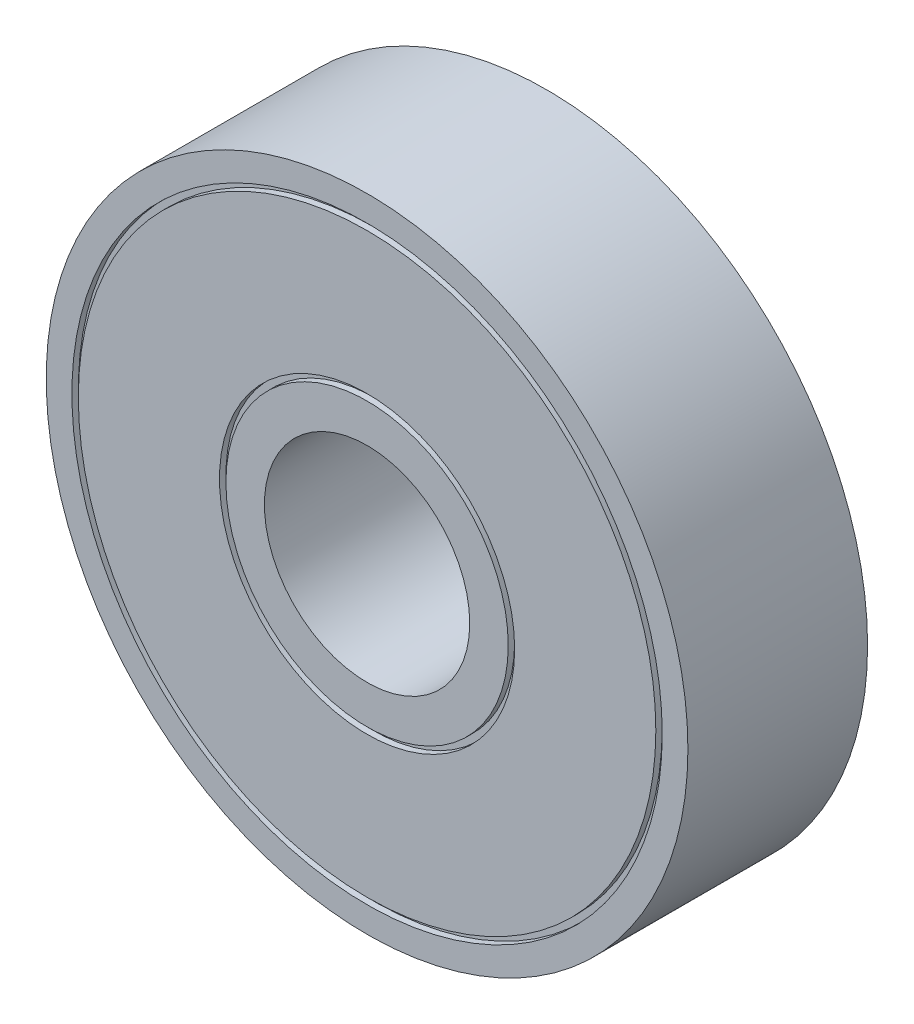
ISO-10303-21;
HEADER;
FILE_DESCRIPTION(('STEP AP214'),'2;1');
FILE_NAME('part.step','',(''),(''),'','','');
FILE_SCHEMA(('AUTOMOTIVE_DESIGN { 1 0 10303 214 1 1 1 1 }'));
ENDSEC;
DATA;
#1=APPLICATION_CONTEXT('core data for automotive mechanical design processes');
#2=APPLICATION_PROTOCOL_DEFINITION('international standard','automotive_design',2000,#1);
#3=PRODUCT_CONTEXT('',#1,'mechanical');
#4=PRODUCT('Part','Part','',(#3));
#5=PRODUCT_RELATED_PRODUCT_CATEGORY('part','',(#4));
#6=PRODUCT_DEFINITION_FORMATION('','',#4);
#7=PRODUCT_DEFINITION_CONTEXT('part definition',#1,'design');
#8=PRODUCT_DEFINITION('design','',#6,#7);
#9=PRODUCT_DEFINITION_SHAPE('','',#8);
#10=(LENGTH_UNIT() NAMED_UNIT(*) SI_UNIT(.MILLI.,.METRE.));
#11=(NAMED_UNIT(*) PLANE_ANGLE_UNIT() SI_UNIT($,.RADIAN.));
#12=(NAMED_UNIT(*) SI_UNIT($,.STERADIAN.) SOLID_ANGLE_UNIT());
#13=UNCERTAINTY_MEASURE_WITH_UNIT(LENGTH_MEASURE(1.E-05),#10,'distance_accuracy_value','');
#14=(GEOMETRIC_REPRESENTATION_CONTEXT(3) GLOBAL_UNCERTAINTY_ASSIGNED_CONTEXT((#13)) GLOBAL_UNIT_ASSIGNED_CONTEXT((#10,
#11,#12)) REPRESENTATION_CONTEXT('',''));
#15=CARTESIAN_POINT('',(0.,0.,0.));
#16=DIRECTION('',(0.,0.,1.));
#17=DIRECTION('',(1.,0.,0.));
#18=AXIS2_PLACEMENT_3D('',#15,#16,#17);
#19=CARTESIAN_POINT('',(0.,0.,-3.5));
#20=DIRECTION('',(0.,0.,1.));
#21=DIRECTION('',(1.,0.,0.));
#22=AXIS2_PLACEMENT_3D('',#19,#20,#21);
#23=PLANE('',#22);
#24=CARTESIAN_POINT('',(0.,0.,-3.5));
#25=DIRECTION('',(0.,0.,1.));
#26=DIRECTION('',(1.,0.,0.));
#27=AXIS2_PLACEMENT_3D('',#24,#25,#26);
#28=CIRCLE('',#27,4.);
#29=CARTESIAN_POINT('',(4.,0.,-3.5));
#30=VERTEX_POINT('',#29);
#31=EDGE_CURVE('E66',#30,#30,#28,.T.);
#32=ORIENTED_EDGE('',*,*,#31,.T.);
#33=EDGE_LOOP('',(#32));
#34=FACE_BOUND('',#33,.T.);
#35=CARTESIAN_POINT('',(0.,0.,-3.5));
#36=DIRECTION('',(0.,0.,1.));
#37=DIRECTION('',(1.,0.,0.));
#38=AXIS2_PLACEMENT_3D('',#35,#36,#37);
#39=CIRCLE('',#38,5.5);
#40=CARTESIAN_POINT('',(5.5,0.,-3.5));
#41=VERTEX_POINT('',#40);
#42=EDGE_CURVE('E111',#41,#41,#39,.T.);
#43=ORIENTED_EDGE('',*,*,#42,.F.);
#44=EDGE_LOOP('',(#43));
#45=FACE_BOUND('',#44,.T.);
#46=ADVANCED_FACE('F51',(#34,#45),#23,.F.);
#47=CARTESIAN_POINT('',(0.,0.,3.5));
#48=DIRECTION('',(0.,0.,1.));
#49=DIRECTION('',(1.,0.,0.));
#50=AXIS2_PLACEMENT_3D('',#47,#48,#49);
#51=PLANE('',#50);
#52=CARTESIAN_POINT('',(0.,0.,3.5));
#53=DIRECTION('',(0.,0.,1.));
#54=DIRECTION('',(1.,0.,0.));
#55=AXIS2_PLACEMENT_3D('',#52,#53,#54);
#56=CIRCLE('',#55,4.);
#57=CARTESIAN_POINT('',(4.,0.,3.5));
#58=VERTEX_POINT('',#57);
#59=EDGE_CURVE('E64',#58,#58,#56,.T.);
#60=ORIENTED_EDGE('',*,*,#59,.F.);
#61=EDGE_LOOP('',(#60));
#62=FACE_BOUND('',#61,.T.);
#63=CARTESIAN_POINT('',(0.,0.,3.5));
#64=DIRECTION('',(0.,0.,1.));
#65=DIRECTION('',(1.,0.,0.));
#66=AXIS2_PLACEMENT_3D('',#63,#64,#65);
#67=CIRCLE('',#66,5.5);
#68=CARTESIAN_POINT('',(5.5,0.,3.5));
#69=VERTEX_POINT('',#68);
#70=EDGE_CURVE('E79',#69,#69,#67,.T.);
#71=ORIENTED_EDGE('',*,*,#70,.T.);
#72=EDGE_LOOP('',(#71));
#73=FACE_BOUND('',#72,.T.);
#74=ADVANCED_FACE('F159',(#62,#73),#51,.T.);
#75=CARTESIAN_POINT('',(0.,0.,3.5));
#76=DIRECTION('',(0.,0.,1.));
#77=DIRECTION('',(1.,0.,0.));
#78=AXIS2_PLACEMENT_3D('',#75,#76,#77);
#79=CIRCLE('',#78,11.5);
#80=CARTESIAN_POINT('',(11.5,0.,3.5));
#81=VERTEX_POINT('',#80);
#82=EDGE_CURVE('E90',#81,#81,#79,.T.);
#83=ORIENTED_EDGE('',*,*,#82,.F.);
#84=EDGE_LOOP('',(#83));
#85=FACE_BOUND('',#84,.T.);
#86=CARTESIAN_POINT('',(0.,0.,3.5));
#87=DIRECTION('',(0.,0.,1.));
#88=DIRECTION('',(1.,0.,0.));
#89=AXIS2_PLACEMENT_3D('',#86,#87,#88);
#90=CIRCLE('',#89,12.5);
#91=CARTESIAN_POINT('',(12.5,0.,3.5));
#92=VERTEX_POINT('',#91);
#93=EDGE_CURVE('E11',#92,#92,#90,.T.);
#94=ORIENTED_EDGE('',*,*,#93,.T.);
#95=EDGE_LOOP('',(#94));
#96=FACE_BOUND('',#95,.T.);
#97=ADVANCED_FACE('F162',(#85,#96),#51,.T.);
#98=CARTESIAN_POINT('',(0.,0.,-3.5));
#99=DIRECTION('',(0.,0.,1.));
#100=DIRECTION('',(1.,0.,0.));
#101=AXIS2_PLACEMENT_3D('',#98,#99,#100);
#102=CIRCLE('',#101,11.5);
#103=CARTESIAN_POINT('',(11.5,0.,-3.5));
#104=VERTEX_POINT('',#103);
#105=EDGE_CURVE('E122',#104,#104,#102,.T.);
#106=ORIENTED_EDGE('',*,*,#105,.T.);
#107=EDGE_LOOP('',(#106));
#108=FACE_BOUND('',#107,.T.);
#109=CARTESIAN_POINT('',(0.,0.,-3.5));
#110=DIRECTION('',(0.,0.,1.));
#111=DIRECTION('',(1.,0.,0.));
#112=AXIS2_PLACEMENT_3D('',#109,#110,#111);
#113=CIRCLE('',#112,12.5);
#114=CARTESIAN_POINT('',(12.5,0.,-3.5));
#115=VERTEX_POINT('',#114);
#116=EDGE_CURVE('E55',#115,#115,#113,.T.);
#117=ORIENTED_EDGE('',*,*,#116,.F.);
#118=EDGE_LOOP('',(#117));
#119=FACE_BOUND('',#118,.T.);
#120=ADVANCED_FACE('F152',(#108,#119),#23,.F.);
#121=CARTESIAN_POINT('',(0.,0.,3.5));
#122=DIRECTION('',(0.,0.,-1.));
#123=DIRECTION('',(-1.,0.,0.));
#124=AXIS2_PLACEMENT_3D('',#121,#122,#123);
#125=CYLINDRICAL_SURFACE('',#124,12.5);
#126=ORIENTED_EDGE('',*,*,#93,.F.);
#127=EDGE_LOOP('',(#126));
#128=FACE_BOUND('',#127,.T.);
#129=ORIENTED_EDGE('',*,*,#116,.T.);
#130=EDGE_LOOP('',(#129));
#131=FACE_BOUND('',#130,.T.);
#132=ADVANCED_FACE('F53',(#128,#131),#125,.T.);
#133=CARTESIAN_POINT('',(0.,0.,3.5));
#134=DIRECTION('',(0.,0.,-1.));
#135=DIRECTION('',(-1.,0.,0.));
#136=AXIS2_PLACEMENT_3D('',#133,#134,#135);
#137=CYLINDRICAL_SURFACE('',#136,4.);
#138=ORIENTED_EDGE('',*,*,#59,.T.);
#139=EDGE_LOOP('',(#138));
#140=FACE_BOUND('',#139,.T.);
#141=ORIENTED_EDGE('',*,*,#31,.F.);
#142=EDGE_LOOP('',(#141));
#143=FACE_BOUND('',#142,.T.);
#144=ADVANCED_FACE('F168',(#140,#143),#137,.F.);
#145=CARTESIAN_POINT('',(0.,0.,3.25));
#146=DIRECTION('',(0.,0.,1.));
#147=DIRECTION('',(1.,0.,0.));
#148=AXIS2_PLACEMENT_3D('',#145,#146,#147);
#149=CYLINDRICAL_SURFACE('',#148,5.5);
#150=CARTESIAN_POINT('',(0.,0.,3.25));
#151=DIRECTION('',(0.,0.,1.));
#152=DIRECTION('',(1.,0.,0.));
#153=AXIS2_PLACEMENT_3D('',#150,#151,#152);
#154=CIRCLE('',#153,5.5);
#155=CARTESIAN_POINT('',(5.5,0.,3.25));
#156=VERTEX_POINT('',#155);
#157=EDGE_CURVE('E78',#156,#156,#154,.T.);
#158=ORIENTED_EDGE('',*,*,#157,.T.);
#159=EDGE_LOOP('',(#158));
#160=FACE_BOUND('',#159,.T.);
#161=ORIENTED_EDGE('',*,*,#70,.F.);
#162=EDGE_LOOP('',(#161));
#163=FACE_BOUND('',#162,.T.);
#164=ADVANCED_FACE('F213',(#160,#163),#149,.T.);
#165=CARTESIAN_POINT('',(0.,0.,3.25));
#166=DIRECTION('',(0.,0.,1.));
#167=DIRECTION('',(1.,0.,0.));
#168=AXIS2_PLACEMENT_3D('',#165,#166,#167);
#169=CYLINDRICAL_SURFACE('',#168,5.75);
#170=CARTESIAN_POINT('',(0.,0.,3.25));
#171=DIRECTION('',(0.,0.,1.));
#172=DIRECTION('',(1.,0.,0.));
#173=AXIS2_PLACEMENT_3D('',#170,#171,#172);
#174=CIRCLE('',#173,5.75);
#175=CARTESIAN_POINT('',(5.75,0.,3.25));
#176=VERTEX_POINT('',#175);
#177=EDGE_CURVE('E70',#176,#176,#174,.T.);
#178=ORIENTED_EDGE('',*,*,#177,.F.);
#179=EDGE_LOOP('',(#178));
#180=FACE_BOUND('',#179,.T.);
#181=CARTESIAN_POINT('',(0.,0.,3.5));
#182=DIRECTION('',(0.,0.,1.));
#183=DIRECTION('',(1.,0.,0.));
#184=AXIS2_PLACEMENT_3D('',#181,#182,#183);
#185=CIRCLE('',#184,5.75);
#186=CARTESIAN_POINT('',(5.75,0.,3.5));
#187=VERTEX_POINT('',#186);
#188=EDGE_CURVE('E74',#187,#187,#185,.T.);
#189=ORIENTED_EDGE('',*,*,#188,.T.);
#190=EDGE_LOOP('',(#189));
#191=FACE_BOUND('',#190,.T.);
#192=ADVANCED_FACE('F209',(#180,#191),#169,.F.);
#193=CARTESIAN_POINT('',(0.,0.,3.25));
#194=DIRECTION('',(0.,0.,1.));
#195=DIRECTION('',(1.,0.,0.));
#196=AXIS2_PLACEMENT_3D('',#193,#194,#195);
#197=PLANE('',#196);
#198=ORIENTED_EDGE('',*,*,#157,.F.);
#199=EDGE_LOOP('',(#198));
#200=FACE_BOUND('',#199,.T.);
#201=ORIENTED_EDGE('',*,*,#177,.T.);
#202=EDGE_LOOP('',(#201));
#203=FACE_BOUND('',#202,.T.);
#204=ADVANCED_FACE('F205',(#200,#203),#197,.T.);
#205=CARTESIAN_POINT('',(0.,0.,3.25));
#206=DIRECTION('',(0.,0.,1.));
#207=DIRECTION('',(1.,0.,0.));
#208=AXIS2_PLACEMENT_3D('',#205,#206,#207);
#209=CYLINDRICAL_SURFACE('',#208,11.25);
#210=CARTESIAN_POINT('',(0.,0.,3.25));
#211=DIRECTION('',(0.,0.,1.));
#212=DIRECTION('',(1.,0.,0.));
#213=AXIS2_PLACEMENT_3D('',#210,#211,#212);
#214=CIRCLE('',#213,11.25);
#215=CARTESIAN_POINT('',(11.25,0.,3.25));
#216=VERTEX_POINT('',#215);
#217=EDGE_CURVE('E94',#216,#216,#214,.T.);
#218=ORIENTED_EDGE('',*,*,#217,.T.);
#219=EDGE_LOOP('',(#218));
#220=FACE_BOUND('',#219,.T.);
#221=CARTESIAN_POINT('',(0.,0.,3.5));
#222=DIRECTION('',(0.,0.,1.));
#223=DIRECTION('',(1.,0.,0.));
#224=AXIS2_PLACEMENT_3D('',#221,#222,#223);
#225=CIRCLE('',#224,11.25);
#226=CARTESIAN_POINT('',(11.25,0.,3.5));
#227=VERTEX_POINT('',#226);
#228=EDGE_CURVE('E95',#227,#227,#225,.T.);
#229=ORIENTED_EDGE('',*,*,#228,.F.);
#230=EDGE_LOOP('',(#229));
#231=FACE_BOUND('',#230,.T.);
#232=ADVANCED_FACE('F201',(#220,#231),#209,.T.);
#233=CARTESIAN_POINT('',(0.,0.,3.25));
#234=DIRECTION('',(0.,0.,1.));
#235=DIRECTION('',(1.,0.,0.));
#236=AXIS2_PLACEMENT_3D('',#233,#234,#235);
#237=CYLINDRICAL_SURFACE('',#236,11.5);
#238=CARTESIAN_POINT('',(0.,0.,3.25));
#239=DIRECTION('',(0.,0.,1.));
#240=DIRECTION('',(1.,0.,0.));
#241=AXIS2_PLACEMENT_3D('',#238,#239,#240);
#242=CIRCLE('',#241,11.5);
#243=CARTESIAN_POINT('',(11.5,0.,3.25));
#244=VERTEX_POINT('',#243);
#245=EDGE_CURVE('E83',#244,#244,#242,.T.);
#246=ORIENTED_EDGE('',*,*,#245,.F.);
#247=EDGE_LOOP('',(#246));
#248=FACE_BOUND('',#247,.T.);
#249=ORIENTED_EDGE('',*,*,#82,.T.);
#250=EDGE_LOOP('',(#249));
#251=FACE_BOUND('',#250,.T.);
#252=ADVANCED_FACE('F197',(#248,#251),#237,.F.);
#253=CARTESIAN_POINT('',(0.,0.,3.25));
#254=DIRECTION('',(0.,0.,1.));
#255=DIRECTION('',(1.,0.,0.));
#256=AXIS2_PLACEMENT_3D('',#253,#254,#255);
#257=PLANE('',#256);
#258=ORIENTED_EDGE('',*,*,#217,.F.);
#259=EDGE_LOOP('',(#258));
#260=FACE_BOUND('',#259,.T.);
#261=ORIENTED_EDGE('',*,*,#245,.T.);
#262=EDGE_LOOP('',(#261));
#263=FACE_BOUND('',#262,.T.);
#264=ADVANCED_FACE('F194',(#260,#263),#257,.T.);
#265=ORIENTED_EDGE('',*,*,#188,.F.);
#266=EDGE_LOOP('',(#265));
#267=FACE_BOUND('',#266,.T.);
#268=ORIENTED_EDGE('',*,*,#228,.T.);
#269=EDGE_LOOP('',(#268));
#270=FACE_BOUND('',#269,.T.);
#271=ADVANCED_FACE('F171',(#267,#270),#51,.T.);
#272=CARTESIAN_POINT('',(0.,0.,-3.25));
#273=DIRECTION('',(0.,0.,-1.));
#274=DIRECTION('',(-1.,0.,0.));
#275=AXIS2_PLACEMENT_3D('',#272,#273,#274);
#276=CYLINDRICAL_SURFACE('',#275,5.5);
#277=CARTESIAN_POINT('',(0.,0.,-3.25));
#278=DIRECTION('',(0.,0.,1.));
#279=DIRECTION('',(1.,0.,0.));
#280=AXIS2_PLACEMENT_3D('',#277,#278,#279);
#281=CIRCLE('',#280,5.5);
#282=CARTESIAN_POINT('',(5.5,0.,-3.25));
#283=VERTEX_POINT('',#282);
#284=EDGE_CURVE('E110',#283,#283,#281,.T.);
#285=ORIENTED_EDGE('',*,*,#284,.F.);
#286=EDGE_LOOP('',(#285));
#287=FACE_BOUND('',#286,.T.);
#288=ORIENTED_EDGE('',*,*,#42,.T.);
#289=EDGE_LOOP('',(#288));
#290=FACE_BOUND('',#289,.T.);
#291=ADVANCED_FACE('F189',(#287,#290),#276,.T.);
#292=CARTESIAN_POINT('',(0.,0.,-3.25));
#293=DIRECTION('',(0.,0.,-1.));
#294=DIRECTION('',(-1.,0.,0.));
#295=AXIS2_PLACEMENT_3D('',#292,#293,#294);
#296=CYLINDRICAL_SURFACE('',#295,5.75);
#297=CARTESIAN_POINT('',(0.,0.,-3.25));
#298=DIRECTION('',(0.,0.,1.));
#299=DIRECTION('',(1.,0.,0.));
#300=AXIS2_PLACEMENT_3D('',#297,#298,#299);
#301=CIRCLE('',#300,5.75);
#302=CARTESIAN_POINT('',(5.75,0.,-3.25));
#303=VERTEX_POINT('',#302);
#304=EDGE_CURVE('E99',#303,#303,#301,.T.);
#305=ORIENTED_EDGE('',*,*,#304,.T.);
#306=EDGE_LOOP('',(#305));
#307=FACE_BOUND('',#306,.T.);
#308=CARTESIAN_POINT('',(0.,0.,-3.5));
#309=DIRECTION('',(0.,0.,1.));
#310=DIRECTION('',(1.,0.,0.));
#311=AXIS2_PLACEMENT_3D('',#308,#309,#310);
#312=CIRCLE('',#311,5.75);
#313=CARTESIAN_POINT('',(5.75,0.,-3.5));
#314=VERTEX_POINT('',#313);
#315=EDGE_CURVE('E106',#314,#314,#312,.T.);
#316=ORIENTED_EDGE('',*,*,#315,.F.);
#317=EDGE_LOOP('',(#316));
#318=FACE_BOUND('',#317,.T.);
#319=ADVANCED_FACE('F185',(#307,#318),#296,.F.);
#320=CARTESIAN_POINT('',(0.,0.,-3.25));
#321=DIRECTION('',(0.,0.,-1.));
#322=DIRECTION('',(1.,0.,0.));
#323=AXIS2_PLACEMENT_3D('',#320,#321,#322);
#324=PLANE('',#323);
#325=ORIENTED_EDGE('',*,*,#284,.T.);
#326=EDGE_LOOP('',(#325));
#327=FACE_BOUND('',#326,.T.);
#328=ORIENTED_EDGE('',*,*,#304,.F.);
#329=EDGE_LOOP('',(#328));
#330=FACE_BOUND('',#329,.T.);
#331=ADVANCED_FACE('F145',(#327,#330),#324,.T.);
#332=CARTESIAN_POINT('',(0.,0.,-3.25));
#333=DIRECTION('',(0.,0.,-1.));
#334=DIRECTION('',(-1.,0.,0.));
#335=AXIS2_PLACEMENT_3D('',#332,#333,#334);
#336=CYLINDRICAL_SURFACE('',#335,11.25);
#337=CARTESIAN_POINT('',(0.,0.,-3.25));
#338=DIRECTION('',(0.,0.,1.));
#339=DIRECTION('',(1.,0.,0.));
#340=AXIS2_PLACEMENT_3D('',#337,#338,#339);
#341=CIRCLE('',#340,11.25);
#342=CARTESIAN_POINT('',(11.25,0.,-3.25));
#343=VERTEX_POINT('',#342);
#344=EDGE_CURVE('E126',#343,#343,#341,.T.);
#345=ORIENTED_EDGE('',*,*,#344,.F.);
#346=EDGE_LOOP('',(#345));
#347=FACE_BOUND('',#346,.T.);
#348=CARTESIAN_POINT('',(0.,0.,-3.5));
#349=DIRECTION('',(0.,0.,1.));
#350=DIRECTION('',(1.,0.,0.));
#351=AXIS2_PLACEMENT_3D('',#348,#349,#350);
#352=CIRCLE('',#351,11.25);
#353=CARTESIAN_POINT('',(11.25,0.,-3.5));
#354=VERTEX_POINT('',#353);
#355=EDGE_CURVE('E127',#354,#354,#352,.T.);
#356=ORIENTED_EDGE('',*,*,#355,.T.);
#357=EDGE_LOOP('',(#356));
#358=FACE_BOUND('',#357,.T.);
#359=ADVANCED_FACE('F141',(#347,#358),#336,.T.);
#360=CARTESIAN_POINT('',(0.,0.,-3.25));
#361=DIRECTION('',(0.,0.,-1.));
#362=DIRECTION('',(-1.,0.,0.));
#363=AXIS2_PLACEMENT_3D('',#360,#361,#362);
#364=CYLINDRICAL_SURFACE('',#363,11.5);
#365=CARTESIAN_POINT('',(0.,0.,-3.25));
#366=DIRECTION('',(0.,0.,1.));
#367=DIRECTION('',(1.,0.,0.));
#368=AXIS2_PLACEMENT_3D('',#365,#366,#367);
#369=CIRCLE('',#368,11.5);
#370=CARTESIAN_POINT('',(11.5,0.,-3.25));
#371=VERTEX_POINT('',#370);
#372=EDGE_CURVE('E115',#371,#371,#369,.T.);
#373=ORIENTED_EDGE('',*,*,#372,.T.);
#374=EDGE_LOOP('',(#373));
#375=FACE_BOUND('',#374,.T.);
#376=ORIENTED_EDGE('',*,*,#105,.F.);
#377=EDGE_LOOP('',(#376));
#378=FACE_BOUND('',#377,.T.);
#379=ADVANCED_FACE('F144',(#375,#378),#364,.F.);
#380=CARTESIAN_POINT('',(0.,0.,-3.25));
#381=DIRECTION('',(0.,0.,-1.));
#382=DIRECTION('',(1.,0.,0.));
#383=AXIS2_PLACEMENT_3D('',#380,#381,#382);
#384=PLANE('',#383);
#385=ORIENTED_EDGE('',*,*,#344,.T.);
#386=EDGE_LOOP('',(#385));
#387=FACE_BOUND('',#386,.T.);
#388=ORIENTED_EDGE('',*,*,#372,.F.);
#389=EDGE_LOOP('',(#388));
#390=FACE_BOUND('',#389,.T.);
#391=ADVANCED_FACE('F138',(#387,#390),#384,.T.);
#392=ORIENTED_EDGE('',*,*,#315,.T.);
#393=EDGE_LOOP('',(#392));
#394=FACE_BOUND('',#393,.T.);
#395=ORIENTED_EDGE('',*,*,#355,.F.);
#396=EDGE_LOOP('',(#395));
#397=FACE_BOUND('',#396,.T.);
#398=ADVANCED_FACE('F149',(#394,#397),#23,.F.);
#399=CLOSED_SHELL('',(#46,#74,#97,#120,#132,#144,#164,#192,#204,#232,#252,#264,#271,#291,#319,
#331,#359,#379,#391,#398));
#400=MANIFOLD_SOLID_BREP('B2',#399);
#401=ADVANCED_BREP_SHAPE_REPRESENTATION('',(#18,#400),#14);
#402=SHAPE_DEFINITION_REPRESENTATION(#9,#401);
ENDSEC;
END-ISO-10303-21;
